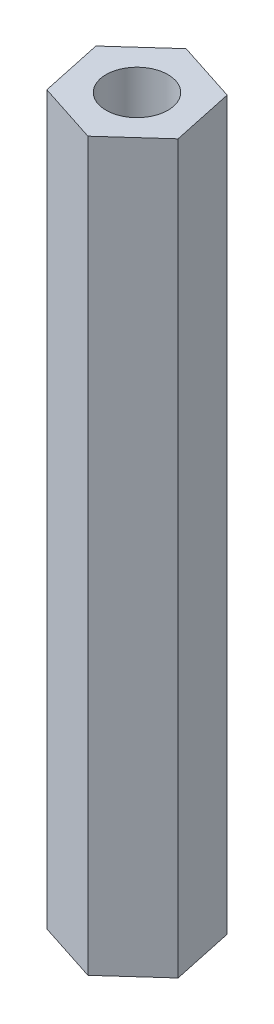
ISO-10303-21;
HEADER;
FILE_DESCRIPTION(('STEP AP214'),'2;1');
FILE_NAME('part.step','',(''),(''),'','','');
FILE_SCHEMA(('AUTOMOTIVE_DESIGN { 1 0 10303 214 1 1 1 1 }'));
ENDSEC;
DATA;
#1=APPLICATION_CONTEXT('core data for automotive mechanical design processes');
#2=APPLICATION_PROTOCOL_DEFINITION('international standard','automotive_design',2000,#1);
#3=PRODUCT_CONTEXT('',#1,'mechanical');
#4=PRODUCT('Part','Part','',(#3));
#5=PRODUCT_RELATED_PRODUCT_CATEGORY('part','',(#4));
#6=PRODUCT_DEFINITION_FORMATION('','',#4);
#7=PRODUCT_DEFINITION_CONTEXT('part definition',#1,'design');
#8=PRODUCT_DEFINITION('design','',#6,#7);
#9=PRODUCT_DEFINITION_SHAPE('','',#8);
#10=(LENGTH_UNIT() NAMED_UNIT(*) SI_UNIT(.MILLI.,.METRE.));
#11=(NAMED_UNIT(*) PLANE_ANGLE_UNIT() SI_UNIT($,.RADIAN.));
#12=(NAMED_UNIT(*) SI_UNIT($,.STERADIAN.) SOLID_ANGLE_UNIT());
#13=UNCERTAINTY_MEASURE_WITH_UNIT(LENGTH_MEASURE(1.E-05),#10,'distance_accuracy_value','');
#14=(GEOMETRIC_REPRESENTATION_CONTEXT(3) GLOBAL_UNCERTAINTY_ASSIGNED_CONTEXT((#13)) GLOBAL_UNIT_ASSIGNED_CONTEXT((#10,
#11,#12)) REPRESENTATION_CONTEXT('',''));
#15=CARTESIAN_POINT('',(0.,0.,0.));
#16=DIRECTION('',(0.,0.,1.));
#17=DIRECTION('',(1.,0.,0.));
#18=AXIS2_PLACEMENT_3D('',#15,#16,#17);
#19=CARTESIAN_POINT('',(0.679103002545253,37.,3.17825724445554));
#20=DIRECTION('',(-0.66992279206715,0.,-0.742430772980858));
#21=DIRECTION('',(-0.742430772980858,0.,0.66992279206715));
#22=AXIS2_PLACEMENT_3D('',#19,#20,#21);
#23=PLANE('',#22);
#24=DIRECTION('',(0.742430772980858,0.,-0.66992279206715));
#25=VECTOR('',#24,1.);
#26=CARTESIAN_POINT('',(0.679103002545253,0.,3.17825724445554));
#27=LINE('',#26,#25);
#28=CARTESIAN_POINT('',(0.679103002545253,0.,3.17825724445554));
#29=VERTEX_POINT('',#28);
#30=CARTESIAN_POINT('',(3.09200301473305,0.,1.00100817023729));
#31=VERTEX_POINT('',#30);
#32=EDGE_CURVE('E128',#29,#31,#27,.T.);
#33=ORIENTED_EDGE('',*,*,#32,.T.);
#34=DIRECTION('',(0.,-1.,0.));
#35=VECTOR('',#34,1.);
#36=CARTESIAN_POINT('',(3.09200301473305,37.,1.00100817023729));
#37=LINE('',#36,#35);
#38=CARTESIAN_POINT('',(3.09200301473305,37.,1.00100817023729));
#39=VERTEX_POINT('',#38);
#40=EDGE_CURVE('E11',#39,#31,#37,.T.);
#41=ORIENTED_EDGE('',*,*,#40,.F.);
#42=DIRECTION('',(0.742430772980858,0.,-0.66992279206715));
#43=VECTOR('',#42,1.);
#44=CARTESIAN_POINT('',(0.679103002545253,37.,3.17825724445554));
#45=LINE('',#44,#43);
#46=CARTESIAN_POINT('',(0.679103002545253,37.,3.17825724445554));
#47=VERTEX_POINT('',#46);
#48=EDGE_CURVE('E139',#47,#39,#45,.T.);
#49=ORIENTED_EDGE('',*,*,#48,.F.);
#50=DIRECTION('',(0.,-1.,0.));
#51=VECTOR('',#50,1.);
#52=CARTESIAN_POINT('',(0.679103002545253,37.,3.17825724445554));
#53=LINE('',#52,#51);
#54=EDGE_CURVE('E124',#47,#29,#53,.T.);
#55=ORIENTED_EDGE('',*,*,#54,.T.);
#56=EDGE_LOOP('',(#33,#41,#49,#55));
#57=FACE_BOUND('',#56,.T.);
#58=ADVANCED_FACE('F41',(#57),#23,.F.);
#59=CARTESIAN_POINT('',(3.09200301473305,37.,1.00100817023729));
#60=DIRECTION('',(-0.977925305986315,0.,0.208954770013924));
#61=DIRECTION('',(0.208954770013924,0.,0.977925305986315));
#62=AXIS2_PLACEMENT_3D('',#59,#60,#61);
#63=PLANE('',#62);
#64=DIRECTION('',(-0.208954770013924,0.,-0.977925305986315));
#65=VECTOR('',#64,1.);
#66=CARTESIAN_POINT('',(3.09200301473305,0.,1.00100817023729));
#67=LINE('',#66,#65);
#68=CARTESIAN_POINT('',(2.41290001218779,0.,-2.17724907421825));
#69=VERTEX_POINT('',#68);
#70=EDGE_CURVE('E131',#31,#69,#67,.T.);
#71=ORIENTED_EDGE('',*,*,#70,.T.);
#72=DIRECTION('',(0.,-1.,0.));
#73=VECTOR('',#72,1.);
#74=CARTESIAN_POINT('',(2.41290001218779,37.,-2.17724907421825));
#75=LINE('',#74,#73);
#76=CARTESIAN_POINT('',(2.41290001218779,37.,-2.17724907421825));
#77=VERTEX_POINT('',#76);
#78=EDGE_CURVE('E49',#77,#69,#75,.T.);
#79=ORIENTED_EDGE('',*,*,#78,.F.);
#80=DIRECTION('',(-0.208954770013924,0.,-0.977925305986315));
#81=VECTOR('',#80,1.);
#82=CARTESIAN_POINT('',(3.09200301473305,37.,1.00100817023729));
#83=LINE('',#82,#81);
#84=EDGE_CURVE('E95',#39,#77,#83,.T.);
#85=ORIENTED_EDGE('',*,*,#84,.F.);
#86=ORIENTED_EDGE('',*,*,#40,.T.);
#87=EDGE_LOOP('',(#71,#79,#85,#86));
#88=FACE_BOUND('',#87,.T.);
#89=ADVANCED_FACE('F164',(#88),#63,.F.);
#90=CARTESIAN_POINT('',(2.41290001218779,37.,-2.17724907421825));
#91=DIRECTION('',(-0.308002513919165,0.,0.951385542994781));
#92=DIRECTION('',(0.951385542994781,0.,0.308002513919165));
#93=AXIS2_PLACEMENT_3D('',#90,#91,#92);
#94=PLANE('',#93);
#95=DIRECTION('',(-0.951385542994781,0.,-0.308002513919165));
#96=VECTOR('',#95,1.);
#97=CARTESIAN_POINT('',(2.41290001218779,0.,-2.17724907421825));
#98=LINE('',#97,#96);
#99=CARTESIAN_POINT('',(-0.679103002545253,0.,-3.17825724445554));
#100=VERTEX_POINT('',#99);
#101=EDGE_CURVE('E134',#69,#100,#98,.T.);
#102=ORIENTED_EDGE('',*,*,#101,.T.);
#103=DIRECTION('',(0.,-1.,0.));
#104=VECTOR('',#103,1.);
#105=CARTESIAN_POINT('',(-0.679103002545253,37.,-3.17825724445554));
#106=LINE('',#105,#104);
#107=CARTESIAN_POINT('',(-0.679103002545253,37.,-3.17825724445554));
#108=VERTEX_POINT('',#107);
#109=EDGE_CURVE('E119',#108,#100,#106,.T.);
#110=ORIENTED_EDGE('',*,*,#109,.F.);
#111=DIRECTION('',(-0.951385542994781,0.,-0.308002513919165));
#112=VECTOR('',#111,1.);
#113=CARTESIAN_POINT('',(2.41290001218779,37.,-2.17724907421825));
#114=LINE('',#113,#112);
#115=EDGE_CURVE('E110',#77,#108,#114,.T.);
#116=ORIENTED_EDGE('',*,*,#115,.F.);
#117=ORIENTED_EDGE('',*,*,#78,.T.);
#118=EDGE_LOOP('',(#102,#110,#116,#117));
#119=FACE_BOUND('',#118,.T.);
#120=ADVANCED_FACE('F145',(#119),#94,.F.);
#121=CARTESIAN_POINT('',(-0.679103002545253,37.,-3.17825724445554));
#122=DIRECTION('',(0.66992279206715,0.,0.742430772980857));
#123=DIRECTION('',(0.742430772980857,0.,-0.66992279206715));
#124=AXIS2_PLACEMENT_3D('',#121,#122,#123);
#125=PLANE('',#124);
#126=DIRECTION('',(-0.742430772980857,0.,0.66992279206715));
#127=VECTOR('',#126,1.);
#128=CARTESIAN_POINT('',(-0.679103002545253,0.,-3.17825724445554));
#129=LINE('',#128,#127);
#130=CARTESIAN_POINT('',(-3.09200301473305,0.,-1.00100817023729));
#131=VERTEX_POINT('',#130);
#132=EDGE_CURVE('E118',#100,#131,#129,.T.);
#133=ORIENTED_EDGE('',*,*,#132,.T.);
#134=DIRECTION('',(0.,-1.,0.));
#135=VECTOR('',#134,1.);
#136=CARTESIAN_POINT('',(-3.09200301473305,37.,-1.00100817023729));
#137=LINE('',#136,#135);
#138=CARTESIAN_POINT('',(-3.09200301473305,37.,-1.00100817023729));
#139=VERTEX_POINT('',#138);
#140=EDGE_CURVE('E115',#139,#131,#137,.T.);
#141=ORIENTED_EDGE('',*,*,#140,.F.);
#142=DIRECTION('',(-0.742430772980857,0.,0.66992279206715));
#143=VECTOR('',#142,1.);
#144=CARTESIAN_POINT('',(-0.679103002545253,37.,-3.17825724445554));
#145=LINE('',#144,#143);
#146=EDGE_CURVE('E104',#108,#139,#145,.T.);
#147=ORIENTED_EDGE('',*,*,#146,.F.);
#148=ORIENTED_EDGE('',*,*,#109,.T.);
#149=EDGE_LOOP('',(#133,#141,#147,#148));
#150=FACE_BOUND('',#149,.T.);
#151=ADVANCED_FACE('F116',(#150),#125,.F.);
#152=CARTESIAN_POINT('',(-3.09200301473305,37.,-1.00100817023729));
#153=DIRECTION('',(0.977925305986315,0.,-0.208954770013923));
#154=DIRECTION('',(-0.208954770013923,0.,-0.977925305986316));
#155=AXIS2_PLACEMENT_3D('',#152,#153,#154);
#156=PLANE('',#155);
#157=DIRECTION('',(0.208954770013923,0.,0.977925305986315));
#158=VECTOR('',#157,1.);
#159=CARTESIAN_POINT('',(-3.09200301473305,0.,-1.00100817023729));
#160=LINE('',#159,#158);
#161=CARTESIAN_POINT('',(-2.4129000121878,0.,2.17724907421825));
#162=VERTEX_POINT('',#161);
#163=EDGE_CURVE('E81',#131,#162,#160,.T.);
#164=ORIENTED_EDGE('',*,*,#163,.T.);
#165=DIRECTION('',(0.,-1.,0.));
#166=VECTOR('',#165,1.);
#167=CARTESIAN_POINT('',(-2.4129000121878,37.,2.17724907421825));
#168=LINE('',#167,#166);
#169=CARTESIAN_POINT('',(-2.4129000121878,37.,2.17724907421825));
#170=VERTEX_POINT('',#169);
#171=EDGE_CURVE('E120',#170,#162,#168,.T.);
#172=ORIENTED_EDGE('',*,*,#171,.F.);
#173=DIRECTION('',(0.208954770013923,0.,0.977925305986315));
#174=VECTOR('',#173,1.);
#175=CARTESIAN_POINT('',(-3.09200301473305,37.,-1.00100817023729));
#176=LINE('',#175,#174);
#177=EDGE_CURVE('E108',#139,#170,#176,.T.);
#178=ORIENTED_EDGE('',*,*,#177,.F.);
#179=ORIENTED_EDGE('',*,*,#140,.T.);
#180=EDGE_LOOP('',(#164,#172,#178,#179));
#181=FACE_BOUND('',#180,.T.);
#182=ADVANCED_FACE('F122',(#181),#156,.F.);
#183=CARTESIAN_POINT('',(-2.4129000121878,37.,2.17724907421825));
#184=DIRECTION('',(0.308002513919165,0.,-0.951385542994781));
#185=DIRECTION('',(-0.951385542994781,0.,-0.308002513919165));
#186=AXIS2_PLACEMENT_3D('',#183,#184,#185);
#187=PLANE('',#186);
#188=DIRECTION('',(0.951385542994781,0.,0.308002513919165));
#189=VECTOR('',#188,1.);
#190=CARTESIAN_POINT('',(-2.4129000121878,0.,2.17724907421825));
#191=LINE('',#190,#189);
#192=EDGE_CURVE('E87',#162,#29,#191,.T.);
#193=ORIENTED_EDGE('',*,*,#192,.T.);
#194=ORIENTED_EDGE('',*,*,#54,.F.);
#195=DIRECTION('',(0.951385542994781,0.,0.308002513919165));
#196=VECTOR('',#195,1.);
#197=CARTESIAN_POINT('',(-2.4129000121878,37.,2.17724907421825));
#198=LINE('',#197,#196);
#199=EDGE_CURVE('E57',#170,#47,#198,.T.);
#200=ORIENTED_EDGE('',*,*,#199,.F.);
#201=ORIENTED_EDGE('',*,*,#171,.T.);
#202=EDGE_LOOP('',(#193,#194,#200,#201));
#203=FACE_BOUND('',#202,.T.);
#204=ADVANCED_FACE('F152',(#203),#187,.F.);
#205=CARTESIAN_POINT('',(0.,37.,0.));
#206=DIRECTION('',(0.,1.,0.));
#207=DIRECTION('',(0.,0.,1.));
#208=AXIS2_PLACEMENT_3D('',#205,#206,#207);
#209=PLANE('',#208);
#210=CARTESIAN_POINT('',(0.,37.,0.));
#211=DIRECTION('',(0.,1.,0.));
#212=DIRECTION('',(0.,0.,1.));
#213=AXIS2_PLACEMENT_3D('',#210,#211,#212);
#214=CIRCLE('',#213,1.57499999999999);
#215=CARTESIAN_POINT('',(0.,37.,1.57499999999999));
#216=VERTEX_POINT('',#215);
#217=EDGE_CURVE('E306',#216,#216,#214,.T.);
#218=ORIENTED_EDGE('',*,*,#217,.F.);
#219=EDGE_LOOP('',(#218));
#220=FACE_BOUND('',#219,.T.);
#221=ORIENTED_EDGE('',*,*,#48,.T.);
#222=ORIENTED_EDGE('',*,*,#84,.T.);
#223=ORIENTED_EDGE('',*,*,#115,.T.);
#224=ORIENTED_EDGE('',*,*,#146,.T.);
#225=ORIENTED_EDGE('',*,*,#177,.T.);
#226=ORIENTED_EDGE('',*,*,#199,.T.);
#227=EDGE_LOOP('',(#221,#222,#223,#224,#225,#226));
#228=FACE_BOUND('',#227,.T.);
#229=ADVANCED_FACE('F106',(#220,#228),#209,.T.);
#230=CARTESIAN_POINT('',(0.,0.,0.));
#231=DIRECTION('',(0.,1.,0.));
#232=DIRECTION('',(0.,0.,1.));
#233=AXIS2_PLACEMENT_3D('',#230,#231,#232);
#234=PLANE('',#233);
#235=CARTESIAN_POINT('',(0.,0.,0.));
#236=DIRECTION('',(0.,-1.,0.));
#237=DIRECTION('',(0.,0.,-1.));
#238=AXIS2_PLACEMENT_3D('',#235,#236,#237);
#239=CIRCLE('',#238,1.57499999999999);
#240=CARTESIAN_POINT('',(0.,0.,-1.57499999999999));
#241=VERTEX_POINT('',#240);
#242=EDGE_CURVE('E308',#241,#241,#239,.T.);
#243=ORIENTED_EDGE('',*,*,#242,.F.);
#244=EDGE_LOOP('',(#243));
#245=FACE_BOUND('',#244,.T.);
#246=ORIENTED_EDGE('',*,*,#32,.F.);
#247=ORIENTED_EDGE('',*,*,#192,.F.);
#248=ORIENTED_EDGE('',*,*,#163,.F.);
#249=ORIENTED_EDGE('',*,*,#132,.F.);
#250=ORIENTED_EDGE('',*,*,#101,.F.);
#251=ORIENTED_EDGE('',*,*,#70,.F.);
#252=EDGE_LOOP('',(#246,#247,#248,#249,#250,#251));
#253=FACE_BOUND('',#252,.T.);
#254=ADVANCED_FACE('F148',(#245,#253),#234,.F.);
#255=CARTESIAN_POINT('',(0.,10.,0.));
#256=DIRECTION('',(0.,-1.,0.));
#257=DIRECTION('',(0.,0.,-1.));
#258=AXIS2_PLACEMENT_3D('',#255,#256,#257);
#259=CONICAL_SURFACE('',#258,1.575,1.02974425867665);
#260=CARTESIAN_POINT('',(0.,10.9463554749684,0.));
#261=VERTEX_POINT('',#260);
#262=VERTEX_LOOP('',#261);
#263=FACE_BOUND('',#262,.T.);
#264=CARTESIAN_POINT('',(0.,10.,0.));
#265=DIRECTION('',(0.,-1.,0.));
#266=DIRECTION('',(0.,0.,-1.));
#267=AXIS2_PLACEMENT_3D('',#264,#265,#266);
#268=CIRCLE('',#267,1.575);
#269=CARTESIAN_POINT('',(0.,10.,-1.575));
#270=VERTEX_POINT('',#269);
#271=EDGE_CURVE('E132',#270,#270,#268,.T.);
#272=ORIENTED_EDGE('',*,*,#271,.T.);
#273=EDGE_LOOP('',(#272));
#274=FACE_BOUND('',#273,.T.);
#275=ADVANCED_FACE('F199',(#263,#274),#259,.F.);
#276=CARTESIAN_POINT('',(0.,0.,0.));
#277=DIRECTION('',(0.,-1.,0.));
#278=DIRECTION('',(0.,0.,-1.));
#279=AXIS2_PLACEMENT_3D('',#276,#277,#278);
#280=CYLINDRICAL_SURFACE('',#279,1.57499999999999);
#281=ORIENTED_EDGE('',*,*,#271,.F.);
#282=EDGE_LOOP('',(#281));
#283=FACE_BOUND('',#282,.T.);
#284=ORIENTED_EDGE('',*,*,#242,.T.);
#285=EDGE_LOOP('',(#284));
#286=FACE_BOUND('',#285,.T.);
#287=ADVANCED_FACE('F211',(#283,#286),#280,.F.);
#288=CARTESIAN_POINT('',(0.,27.,0.));
#289=DIRECTION('',(0.,1.,0.));
#290=DIRECTION('',(0.,0.,1.));
#291=AXIS2_PLACEMENT_3D('',#288,#289,#290);
#292=CONICAL_SURFACE('',#291,1.57499999999999,1.02974425867665);
#293=CARTESIAN_POINT('',(0.,26.0536445250316,0.));
#294=VERTEX_POINT('',#293);
#295=VERTEX_LOOP('',#294);
#296=FACE_BOUND('',#295,.T.);
#297=CARTESIAN_POINT('',(0.,27.,0.));
#298=DIRECTION('',(0.,1.,0.));
#299=DIRECTION('',(0.,0.,1.));
#300=AXIS2_PLACEMENT_3D('',#297,#298,#299);
#301=CIRCLE('',#300,1.57499999999999);
#302=CARTESIAN_POINT('',(0.,27.,1.57499999999999));
#303=VERTEX_POINT('',#302);
#304=EDGE_CURVE('E303',#303,#303,#301,.T.);
#305=ORIENTED_EDGE('',*,*,#304,.T.);
#306=EDGE_LOOP('',(#305));
#307=FACE_BOUND('',#306,.T.);
#308=ADVANCED_FACE('F223',(#296,#307),#292,.F.);
#309=CARTESIAN_POINT('',(0.,37.,0.));
#310=DIRECTION('',(0.,1.,0.));
#311=DIRECTION('',(0.,0.,1.));
#312=AXIS2_PLACEMENT_3D('',#309,#310,#311);
#313=CYLINDRICAL_SURFACE('',#312,1.57499999999999);
#314=ORIENTED_EDGE('',*,*,#304,.F.);
#315=EDGE_LOOP('',(#314));
#316=FACE_BOUND('',#315,.T.);
#317=ORIENTED_EDGE('',*,*,#217,.T.);
#318=EDGE_LOOP('',(#317));
#319=FACE_BOUND('',#318,.T.);
#320=ADVANCED_FACE('F244',(#316,#319),#313,.F.);
#321=CLOSED_SHELL('',(#58,#89,#120,#151,#182,#204,#229,#254,#275,#287,#308,#320));
#322=MANIFOLD_SOLID_BREP('B2',#321);
#323=ADVANCED_BREP_SHAPE_REPRESENTATION('',(#18,#322),#14);
#324=SHAPE_DEFINITION_REPRESENTATION(#9,#323);
ENDSEC;
END-ISO-10303-21;
